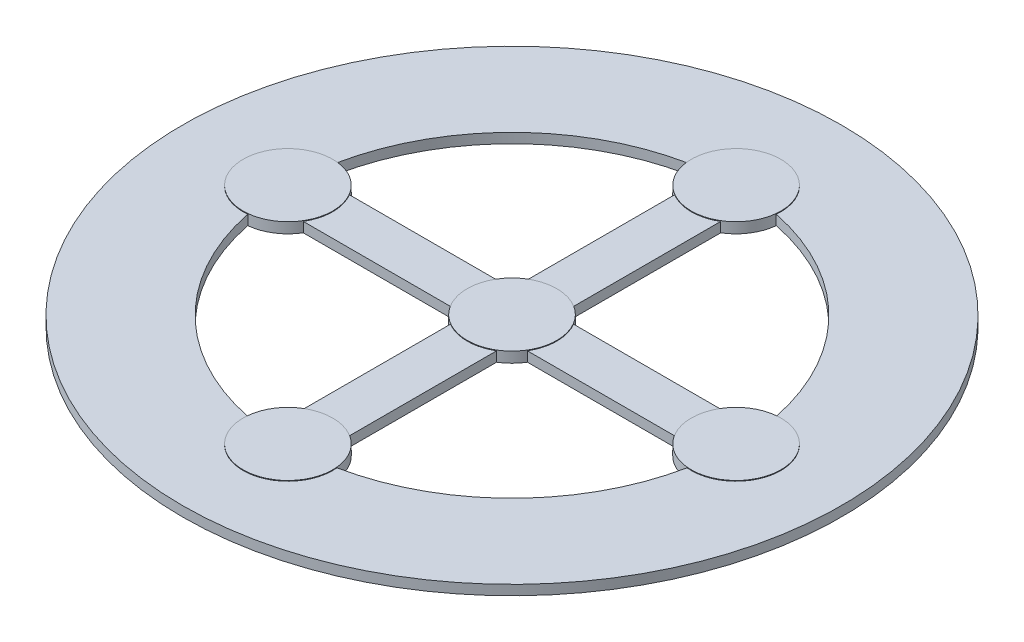
ISO-10303-21;
HEADER;
FILE_DESCRIPTION(('STEP AP214'),'2;1');
FILE_NAME('part.step','',(''),(''),'','','');
FILE_SCHEMA(('AUTOMOTIVE_DESIGN { 1 0 10303 214 1 1 1 1 }'));
ENDSEC;
DATA;
#1=APPLICATION_CONTEXT('core data for automotive mechanical design processes');
#2=APPLICATION_PROTOCOL_DEFINITION('international standard','automotive_design',2000,#1);
#3=PRODUCT_CONTEXT('',#1,'mechanical');
#4=PRODUCT('Part','Part','',(#3));
#5=PRODUCT_RELATED_PRODUCT_CATEGORY('part','',(#4));
#6=PRODUCT_DEFINITION_FORMATION('','',#4);
#7=PRODUCT_DEFINITION_CONTEXT('part definition',#1,'design');
#8=PRODUCT_DEFINITION('design','',#6,#7);
#9=PRODUCT_DEFINITION_SHAPE('','',#8);
#10=(LENGTH_UNIT() NAMED_UNIT(*) SI_UNIT(.MILLI.,.METRE.));
#11=(NAMED_UNIT(*) PLANE_ANGLE_UNIT() SI_UNIT($,.RADIAN.));
#12=(NAMED_UNIT(*) SI_UNIT($,.STERADIAN.) SOLID_ANGLE_UNIT());
#13=UNCERTAINTY_MEASURE_WITH_UNIT(LENGTH_MEASURE(1.E-05),#10,'distance_accuracy_value','');
#14=(GEOMETRIC_REPRESENTATION_CONTEXT(3) GLOBAL_UNCERTAINTY_ASSIGNED_CONTEXT((#13)) GLOBAL_UNIT_ASSIGNED_CONTEXT((#10,
#11,#12)) REPRESENTATION_CONTEXT('',''));
#15=CARTESIAN_POINT('',(0.,0.,0.));
#16=DIRECTION('',(0.,0.,1.));
#17=DIRECTION('',(1.,0.,0.));
#18=AXIS2_PLACEMENT_3D('',#15,#16,#17);
#19=CARTESIAN_POINT('',(0.,15.,0.));
#20=DIRECTION('',(0.,1.,0.));
#21=DIRECTION('',(0.,0.,1.));
#22=AXIS2_PLACEMENT_3D('',#19,#20,#21);
#23=PLANE('',#22);
#24=DIRECTION('',(-1.,0.,0.));
#25=VECTOR('',#24,1.);
#26=CARTESIAN_POINT('',(-58.3009433885882,15.,34.9999999999994));
#27=LINE('',#26,#25);
#28=CARTESIAN_POINT('',(-58.3009433885882,15.,34.9999999999994));
#29=VERTEX_POINT('',#28);
#30=CARTESIAN_POINT('',(-281.69905661141,15.,34.9999999999983));
#31=VERTEX_POINT('',#30);
#32=EDGE_CURVE('E268',#29,#31,#27,.T.);
#33=ORIENTED_EDGE('',*,*,#32,.F.);
#34=CARTESIAN_POINT('',(0.,15.,0.));
#35=DIRECTION('',(0.,1.,0.));
#36=DIRECTION('',(0.,0.,1.));
#37=AXIS2_PLACEMENT_3D('',#34,#35,#36);
#38=CIRCLE('',#37,67.9999999999951);
#39=CARTESIAN_POINT('',(-58.3009433885875,15.,-35.0000000000006));
#40=VERTEX_POINT('',#39);
#41=EDGE_CURVE('E224',#40,#29,#38,.T.);
#42=ORIENTED_EDGE('',*,*,#41,.F.);
#43=DIRECTION('',(1.,0.,0.));
#44=VECTOR('',#43,1.);
#45=CARTESIAN_POINT('',(-281.699056611412,15.,-35.000000000003));
#46=LINE('',#45,#44);
#47=CARTESIAN_POINT('',(-281.699056611415,15.,-35.0000000000029));
#48=VERTEX_POINT('',#47);
#49=EDGE_CURVE('E438',#48,#40,#46,.T.);
#50=ORIENTED_EDGE('',*,*,#49,.F.);
#51=CARTESIAN_POINT('',(-340.,15.,1.18710365520667E-12));
#52=DIRECTION('',(0.,1.,0.));
#53=DIRECTION('',(0.,0.,1.));
#54=AXIS2_PLACEMENT_3D('',#51,#52,#53);
#55=CIRCLE('',#54,67.9999999999951);
#56=EDGE_CURVE('E12',#48,#31,#55,.F.);
#57=ORIENTED_EDGE('',*,*,#56,.T.);
#58=EDGE_LOOP('',(#33,#42,#50,#57));
#59=FACE_BOUND('',#58,.T.);
#60=ADVANCED_FACE('F48',(#59),#23,.T.);
#61=DIRECTION('',(0.,0.,-1.));
#62=VECTOR('',#61,1.);
#63=CARTESIAN_POINT('',(-35.,15.,-58.3009433885879));
#64=LINE('',#63,#62);
#65=CARTESIAN_POINT('',(-35.,15.,-58.3009433885879));
#66=VERTEX_POINT('',#65);
#67=CARTESIAN_POINT('',(-35.,15.,-281.699056611412));
#68=VERTEX_POINT('',#67);
#69=EDGE_CURVE('E265',#66,#68,#64,.T.);
#70=ORIENTED_EDGE('',*,*,#69,.F.);
#71=CARTESIAN_POINT('',(35.,15.,-58.3009433885879));
#72=VERTEX_POINT('',#71);
#73=EDGE_CURVE('E64',#72,#66,#38,.T.);
#74=ORIENTED_EDGE('',*,*,#73,.F.);
#75=DIRECTION('',(0.,0.,1.));
#76=VECTOR('',#75,1.);
#77=CARTESIAN_POINT('',(35.,15.,-281.699056611412));
#78=LINE('',#77,#76);
#79=CARTESIAN_POINT('',(35.,15.,-281.699056611412));
#80=VERTEX_POINT('',#79);
#81=EDGE_CURVE('E423',#80,#72,#78,.T.);
#82=ORIENTED_EDGE('',*,*,#81,.F.);
#83=CARTESIAN_POINT('',(0.,15.,-340.));
#84=DIRECTION('',(0.,1.,0.));
#85=DIRECTION('',(0.,0.,1.));
#86=AXIS2_PLACEMENT_3D('',#83,#84,#85);
#87=CIRCLE('',#86,67.9999999999951);
#88=EDGE_CURVE('E391',#68,#80,#87,.T.);
#89=ORIENTED_EDGE('',*,*,#88,.F.);
#90=EDGE_LOOP('',(#70,#74,#82,#89));
#91=FACE_BOUND('',#90,.T.);
#92=ADVANCED_FACE('F559',(#91),#23,.T.);
#93=DIRECTION('',(1.,0.,0.));
#94=VECTOR('',#93,1.);
#95=CARTESIAN_POINT('',(58.300943388588,15.,-34.9999999999998));
#96=LINE('',#95,#94);
#97=CARTESIAN_POINT('',(58.300943388588,15.,-34.9999999999998));
#98=VERTEX_POINT('',#97);
#99=CARTESIAN_POINT('',(281.69905661141,15.,-35.0000000000003));
#100=VERTEX_POINT('',#99);
#101=EDGE_CURVE('E406',#98,#100,#96,.T.);
#102=ORIENTED_EDGE('',*,*,#101,.F.);
#103=CARTESIAN_POINT('',(58.3009433885877,15.,35.0000000000002));
#104=VERTEX_POINT('',#103);
#105=EDGE_CURVE('E226',#104,#98,#38,.T.);
#106=ORIENTED_EDGE('',*,*,#105,.F.);
#107=DIRECTION('',(-1.,0.,0.));
#108=VECTOR('',#107,1.);
#109=CARTESIAN_POINT('',(281.699056611412,15.,35.000000000001));
#110=LINE('',#109,#108);
#111=CARTESIAN_POINT('',(281.699056611415,15.,35.000000000001));
#112=VERTEX_POINT('',#111);
#113=EDGE_CURVE('E242',#112,#104,#110,.T.);
#114=ORIENTED_EDGE('',*,*,#113,.F.);
#115=CARTESIAN_POINT('',(340.,15.,-3.56131096562E-12));
#116=DIRECTION('',(0.,1.,0.));
#117=DIRECTION('',(0.,0.,1.));
#118=AXIS2_PLACEMENT_3D('',#115,#116,#117);
#119=CIRCLE('',#118,67.9999999999951);
#120=EDGE_CURVE('E393',#112,#100,#119,.F.);
#121=ORIENTED_EDGE('',*,*,#120,.T.);
#122=EDGE_LOOP('',(#102,#106,#114,#121));
#123=FACE_BOUND('',#122,.T.);
#124=ADVANCED_FACE('F404',(#123),#23,.T.);
#125=DIRECTION('',(0.,0.,1.));
#126=VECTOR('',#125,1.);
#127=CARTESIAN_POINT('',(34.9999999999996,15.,58.3009433885881));
#128=LINE('',#127,#126);
#129=CARTESIAN_POINT('',(34.9999999999996,15.,58.3009433885881));
#130=VERTEX_POINT('',#129);
#131=CARTESIAN_POINT('',(34.9999999999997,15.,281.699056611412));
#132=VERTEX_POINT('',#131);
#133=EDGE_CURVE('E231',#130,#132,#128,.T.);
#134=ORIENTED_EDGE('',*,*,#133,.F.);
#135=CARTESIAN_POINT('',(-35.0000000000004,15.,58.3009433885876));
#136=VERTEX_POINT('',#135);
#137=EDGE_CURVE('E210',#136,#130,#38,.T.);
#138=ORIENTED_EDGE('',*,*,#137,.F.);
#139=DIRECTION('',(0.,0.,-1.));
#140=VECTOR('',#139,1.);
#141=CARTESIAN_POINT('',(-35.0000000000012,15.,281.699056611413));
#142=LINE('',#141,#140);
#143=CARTESIAN_POINT('',(-35.0000000000012,15.,281.699056611413));
#144=VERTEX_POINT('',#143);
#145=EDGE_CURVE('E264',#144,#136,#142,.T.);
#146=ORIENTED_EDGE('',*,*,#145,.F.);
#147=CARTESIAN_POINT('',(0.,15.,340.));
#148=DIRECTION('',(0.,1.,0.));
#149=DIRECTION('',(0.,0.,1.));
#150=AXIS2_PLACEMENT_3D('',#147,#148,#149);
#151=CIRCLE('',#150,67.9999999999951);
#152=EDGE_CURVE('E239',#144,#132,#151,.F.);
#153=ORIENTED_EDGE('',*,*,#152,.T.);
#154=EDGE_LOOP('',(#134,#138,#146,#153));
#155=FACE_BOUND('',#154,.T.);
#156=ADVANCED_FACE('F238',(#155),#23,.T.);
#157=CARTESIAN_POINT('',(0.,0.,0.));
#158=DIRECTION('',(0.,1.,0.));
#159=DIRECTION('',(0.,0.,1.));
#160=AXIS2_PLACEMENT_3D('',#157,#158,#159);
#161=PLANE('',#160);
#162=CARTESIAN_POINT('',(0.,0.,0.));
#163=DIRECTION('',(0.,1.,0.));
#164=DIRECTION('',(0.,0.,1.));
#165=AXIS2_PLACEMENT_3D('',#162,#163,#164);
#166=CIRCLE('',#165,500.);
#167=CARTESIAN_POINT('',(0.,0.,500.));
#168=VERTEX_POINT('',#167);
#169=EDGE_CURVE('E277',#168,#168,#166,.T.);
#170=ORIENTED_EDGE('',*,*,#169,.F.);
#171=EDGE_LOOP('',(#170));
#172=FACE_BOUND('',#171,.T.);
#173=CARTESIAN_POINT('',(-340.,0.,-3.56131096562E-12));
#174=DIRECTION('',(0.,1.,0.));
#175=DIRECTION('',(0.,0.,1.));
#176=AXIS2_PLACEMENT_3D('',#173,#174,#175);
#177=CIRCLE('',#176,67.9999999999951);
#178=CARTESIAN_POINT('',(-281.699056611412,0.,34.9999999999971));
#179=VERTEX_POINT('',#178);
#180=CARTESIAN_POINT('',(-333.200000000002,0.,67.6591457232418));
#181=VERTEX_POINT('',#180);
#182=EDGE_CURVE('E311',#179,#181,#177,.F.);
#183=ORIENTED_EDGE('',*,*,#182,.T.);
#184=CARTESIAN_POINT('',(0.,0.,0.));
#185=DIRECTION('',(0.,1.,0.));
#186=DIRECTION('',(0.,0.,1.));
#187=AXIS2_PLACEMENT_3D('',#184,#185,#186);
#188=CIRCLE('',#187,340.);
#189=CARTESIAN_POINT('',(-67.6591457232464,0.,333.200000000001));
#190=VERTEX_POINT('',#189);
#191=EDGE_CURVE('E315',#181,#190,#188,.T.);
#192=ORIENTED_EDGE('',*,*,#191,.T.);
#193=CARTESIAN_POINT('',(-1.16628465962116E-12,0.,340.000000000001));
#194=DIRECTION('',(0.,1.,0.));
#195=DIRECTION('',(0.,0.,1.));
#196=AXIS2_PLACEMENT_3D('',#193,#194,#195);
#197=CIRCLE('',#196,67.9999999999952);
#198=CARTESIAN_POINT('',(-35.0000000000012,0.,281.699056611413));
#199=VERTEX_POINT('',#198);
#200=EDGE_CURVE('E295',#190,#199,#197,.F.);
#201=ORIENTED_EDGE('',*,*,#200,.T.);
#202=DIRECTION('',(0.,0.,-1.));
#203=VECTOR('',#202,1.);
#204=CARTESIAN_POINT('',(-35.0000000000002,0.,-1.17409312811016E-13));
#205=LINE('',#204,#203);
#206=CARTESIAN_POINT('',(-35.0000000000004,0.,58.3009433885876));
#207=VERTEX_POINT('',#206);
#208=EDGE_CURVE('E299',#199,#207,#205,.T.);
#209=ORIENTED_EDGE('',*,*,#208,.T.);
#210=CARTESIAN_POINT('',(0.,0.,0.));
#211=DIRECTION('',(0.,1.,0.));
#212=DIRECTION('',(0.,0.,1.));
#213=AXIS2_PLACEMENT_3D('',#210,#211,#212);
#214=CIRCLE('',#213,67.9999999999951);
#215=CARTESIAN_POINT('',(-58.3009433885882,0.,34.9999999999994));
#216=VERTEX_POINT('',#215);
#217=EDGE_CURVE('E303',#207,#216,#214,.F.);
#218=ORIENTED_EDGE('',*,*,#217,.T.);
#219=DIRECTION('',(-1.,0.,0.));
#220=VECTOR('',#219,1.);
#221=CARTESIAN_POINT('',(-3.70709033968115E-13,0.,35.));
#222=LINE('',#221,#220);
#223=EDGE_CURVE('E307',#216,#179,#222,.T.);
#224=ORIENTED_EDGE('',*,*,#223,.T.);
#225=EDGE_LOOP('',(#183,#192,#201,#209,#218,#224));
#226=FACE_BOUND('',#225,.T.);
#227=CARTESIAN_POINT('',(0.,0.,0.));
#228=DIRECTION('',(0.,1.,0.));
#229=DIRECTION('',(0.,0.,1.));
#230=AXIS2_PLACEMENT_3D('',#227,#228,#229);
#231=CIRCLE('',#230,340.);
#232=CARTESIAN_POINT('',(333.200000000001,0.,-67.6591457232442));
#233=VERTEX_POINT('',#232);
#234=CARTESIAN_POINT('',(67.6591457232453,0.,-333.200000000001));
#235=VERTEX_POINT('',#234);
#236=EDGE_CURVE('E335',#233,#235,#231,.T.);
#237=ORIENTED_EDGE('',*,*,#236,.T.);
#238=CARTESIAN_POINT('',(0.,0.,-340.));
#239=DIRECTION('',(0.,1.,0.));
#240=DIRECTION('',(0.,0.,1.));
#241=AXIS2_PLACEMENT_3D('',#238,#239,#240);
#242=CIRCLE('',#241,67.9999999999951);
#243=CARTESIAN_POINT('',(35.,0.,-281.699056611412));
#244=VERTEX_POINT('',#243);
#245=EDGE_CURVE('E339',#235,#244,#242,.F.);
#246=ORIENTED_EDGE('',*,*,#245,.T.);
#247=DIRECTION('',(0.,0.,1.));
#248=VECTOR('',#247,1.);
#249=CARTESIAN_POINT('',(35.,0.,0.));
#250=LINE('',#249,#248);
#251=CARTESIAN_POINT('',(35.,0.,-58.3009433885879));
#252=VERTEX_POINT('',#251);
#253=EDGE_CURVE('E319',#244,#252,#250,.T.);
#254=ORIENTED_EDGE('',*,*,#253,.T.);
#255=CARTESIAN_POINT('',(0.,0.,0.));
#256=DIRECTION('',(0.,1.,0.));
#257=DIRECTION('',(0.,0.,1.));
#258=AXIS2_PLACEMENT_3D('',#255,#256,#257);
#259=CIRCLE('',#258,67.9999999999951);
#260=CARTESIAN_POINT('',(58.300943388588,0.,-34.9999999999998));
#261=VERTEX_POINT('',#260);
#262=EDGE_CURVE('E323',#252,#261,#259,.F.);
#263=ORIENTED_EDGE('',*,*,#262,.T.);
#264=DIRECTION('',(1.,0.,0.));
#265=VECTOR('',#264,1.);
#266=CARTESIAN_POINT('',(1.27193422211934E-13,0.,-35.));
#267=LINE('',#266,#265);
#268=CARTESIAN_POINT('',(281.699056611412,0.,-34.999999999999));
#269=VERTEX_POINT('',#268);
#270=EDGE_CURVE('E327',#261,#269,#267,.T.);
#271=ORIENTED_EDGE('',*,*,#270,.T.);
#272=CARTESIAN_POINT('',(340.,0.,1.18710365520667E-12));
#273=DIRECTION('',(0.,1.,0.));
#274=DIRECTION('',(0.,0.,1.));
#275=AXIS2_PLACEMENT_3D('',#272,#273,#274);
#276=CIRCLE('',#275,67.9999999999951);
#277=EDGE_CURVE('E331',#269,#233,#276,.F.);
#278=ORIENTED_EDGE('',*,*,#277,.T.);
#279=EDGE_LOOP('',(#237,#246,#254,#263,#271,#278));
#280=FACE_BOUND('',#279,.T.);
#281=CARTESIAN_POINT('',(-1.16628465962116E-12,0.,340.000000000001));
#282=DIRECTION('',(0.,1.,0.));
#283=DIRECTION('',(0.,0.,1.));
#284=AXIS2_PLACEMENT_3D('',#281,#282,#283);
#285=CIRCLE('',#284,67.9999999999952);
#286=CARTESIAN_POINT('',(34.9999999999988,0.,281.699056611413));
#287=VERTEX_POINT('',#286);
#288=CARTESIAN_POINT('',(67.6591457232441,0.,333.200000000001));
#289=VERTEX_POINT('',#288);
#290=EDGE_CURVE('E359',#287,#289,#285,.F.);
#291=ORIENTED_EDGE('',*,*,#290,.T.);
#292=CARTESIAN_POINT('',(0.,0.,0.));
#293=DIRECTION('',(0.,1.,0.));
#294=DIRECTION('',(0.,0.,1.));
#295=AXIS2_PLACEMENT_3D('',#292,#293,#294);
#296=CIRCLE('',#295,340.);
#297=CARTESIAN_POINT('',(333.200000000001,0.,67.6591457232465));
#298=VERTEX_POINT('',#297);
#299=EDGE_CURVE('E363',#289,#298,#296,.T.);
#300=ORIENTED_EDGE('',*,*,#299,.T.);
#301=CARTESIAN_POINT('',(340.,0.,1.18710365520667E-12));
#302=DIRECTION('',(0.,1.,0.));
#303=DIRECTION('',(0.,0.,1.));
#304=AXIS2_PLACEMENT_3D('',#301,#302,#303);
#305=CIRCLE('',#304,67.9999999999951);
#306=CARTESIAN_POINT('',(281.699056611412,0.,35.000000000001));
#307=VERTEX_POINT('',#306);
#308=EDGE_CURVE('E343',#298,#307,#305,.F.);
#309=ORIENTED_EDGE('',*,*,#308,.T.);
#310=DIRECTION('',(-1.,0.,0.));
#311=VECTOR('',#310,1.);
#312=CARTESIAN_POINT('',(-1.18496436077785E-13,0.,35.));
#313=LINE('',#312,#311);
#314=CARTESIAN_POINT('',(58.3009433885877,0.,35.0000000000002));
#315=VERTEX_POINT('',#314);
#316=EDGE_CURVE('E350',#307,#315,#313,.T.);
#317=ORIENTED_EDGE('',*,*,#316,.T.);
#318=CARTESIAN_POINT('',(0.,0.,0.));
#319=DIRECTION('',(0.,1.,0.));
#320=DIRECTION('',(0.,0.,1.));
#321=AXIS2_PLACEMENT_3D('',#318,#319,#320);
#322=CIRCLE('',#321,67.9999999999951);
#323=CARTESIAN_POINT('',(34.9999999999996,0.,58.3009433885881));
#324=VERTEX_POINT('',#323);
#325=EDGE_CURVE('E354',#315,#324,#322,.F.);
#326=ORIENTED_EDGE('',*,*,#325,.T.);
#327=DIRECTION('',(0.,0.,1.));
#328=VECTOR('',#327,1.);
#329=CARTESIAN_POINT('',(34.9999999999998,0.,1.26106298945164E-13));
#330=LINE('',#329,#328);
#331=EDGE_CURVE('E233',#324,#287,#330,.T.);
#332=ORIENTED_EDGE('',*,*,#331,.T.);
#333=EDGE_LOOP('',(#291,#300,#309,#317,#326,#332));
#334=FACE_BOUND('',#333,.T.);
#335=DIRECTION('',(1.,0.,0.));
#336=VECTOR('',#335,1.);
#337=CARTESIAN_POINT('',(3.62012047833966E-13,0.,-35.));
#338=LINE('',#337,#336);
#339=CARTESIAN_POINT('',(-281.699056611412,0.,-35.000000000003));
#340=VERTEX_POINT('',#339);
#341=CARTESIAN_POINT('',(-58.3009433885875,0.,-35.0000000000006));
#342=VERTEX_POINT('',#341);
#343=EDGE_CURVE('E383',#340,#342,#338,.T.);
#344=ORIENTED_EDGE('',*,*,#343,.T.);
#345=CARTESIAN_POINT('',(0.,0.,0.));
#346=DIRECTION('',(0.,1.,0.));
#347=DIRECTION('',(0.,0.,1.));
#348=AXIS2_PLACEMENT_3D('',#345,#346,#347);
#349=CIRCLE('',#348,67.9999999999951);
#350=CARTESIAN_POINT('',(-35.,0.,-58.3009433885879));
#351=VERTEX_POINT('',#350);
#352=EDGE_CURVE('E387',#342,#351,#349,.F.);
#353=ORIENTED_EDGE('',*,*,#352,.T.);
#354=DIRECTION('',(0.,0.,-1.));
#355=VECTOR('',#354,1.);
#356=CARTESIAN_POINT('',(-35.,0.,0.));
#357=LINE('',#356,#355);
#358=CARTESIAN_POINT('',(-35.,0.,-281.699056611412));
#359=VERTEX_POINT('',#358);
#360=EDGE_CURVE('E367',#351,#359,#357,.T.);
#361=ORIENTED_EDGE('',*,*,#360,.T.);
#362=CARTESIAN_POINT('',(0.,0.,-340.));
#363=DIRECTION('',(0.,1.,0.));
#364=DIRECTION('',(0.,0.,1.));
#365=AXIS2_PLACEMENT_3D('',#362,#363,#364);
#366=CIRCLE('',#365,67.9999999999951);
#367=CARTESIAN_POINT('',(-67.6591457232453,0.,-333.200000000001));
#368=VERTEX_POINT('',#367);
#369=EDGE_CURVE('E371',#359,#368,#366,.F.);
#370=ORIENTED_EDGE('',*,*,#369,.T.);
#371=CARTESIAN_POINT('',(0.,0.,0.));
#372=DIRECTION('',(0.,1.,0.));
#373=DIRECTION('',(0.,0.,1.));
#374=AXIS2_PLACEMENT_3D('',#371,#372,#373);
#375=CIRCLE('',#374,340.);
#376=CARTESIAN_POINT('',(-333.2,0.,-67.659145723249));
#377=VERTEX_POINT('',#376);
#378=EDGE_CURVE('E375',#368,#377,#375,.T.);
#379=ORIENTED_EDGE('',*,*,#378,.T.);
#380=CARTESIAN_POINT('',(-340.,0.,-3.56131096562E-12));
#381=DIRECTION('',(0.,1.,0.));
#382=DIRECTION('',(0.,0.,1.));
#383=AXIS2_PLACEMENT_3D('',#380,#381,#382);
#384=CIRCLE('',#383,67.9999999999951);
#385=EDGE_CURVE('E379',#377,#340,#384,.F.);
#386=ORIENTED_EDGE('',*,*,#385,.T.);
#387=EDGE_LOOP('',(#344,#353,#361,#370,#379,#386));
#388=FACE_BOUND('',#387,.T.);
#389=ADVANCED_FACE('F50',(#172,#226,#280,#334,#388),#161,.F.);
#390=CARTESIAN_POINT('',(0.,-15.,0.));
#391=DIRECTION('',(0.,1.,0.));
#392=DIRECTION('',(0.,0.,1.));
#393=AXIS2_PLACEMENT_3D('',#390,#391,#392);
#394=CYLINDRICAL_SURFACE('',#393,340.);
#395=DIRECTION('',(0.,1.,0.));
#396=VECTOR('',#395,1.);
#397=CARTESIAN_POINT('',(-333.200000000002,-15.,67.6591457232418));
#398=LINE('',#397,#396);
#399=CARTESIAN_POINT('',(-333.200000000001,15.,67.6591457232465));
#400=VERTEX_POINT('',#399);
#401=EDGE_CURVE('E273',#181,#400,#398,.T.);
#402=ORIENTED_EDGE('',*,*,#401,.T.);
#403=CARTESIAN_POINT('',(0.,15.,0.));
#404=DIRECTION('',(0.,1.,0.));
#405=DIRECTION('',(0.,0.,1.));
#406=AXIS2_PLACEMENT_3D('',#403,#404,#405);
#407=CIRCLE('',#406,340.);
#408=CARTESIAN_POINT('',(-67.6591457232464,15.,333.200000000001));
#409=VERTEX_POINT('',#408);
#410=EDGE_CURVE('E260',#400,#409,#407,.T.);
#411=ORIENTED_EDGE('',*,*,#410,.T.);
#412=DIRECTION('',(0.,1.,0.));
#413=VECTOR('',#412,1.);
#414=CARTESIAN_POINT('',(-67.6591457232464,-15.,333.200000000001));
#415=LINE('',#414,#413);
#416=EDGE_CURVE('E272',#190,#409,#415,.T.);
#417=ORIENTED_EDGE('',*,*,#416,.F.);
#418=ORIENTED_EDGE('',*,*,#191,.F.);
#419=EDGE_LOOP('',(#402,#411,#417,#418));
#420=FACE_BOUND('',#419,.T.);
#421=ADVANCED_FACE('F568',(#420),#394,.F.);
#422=CARTESIAN_POINT('',(-58.3009433885882,-15.,34.9999999999994));
#423=DIRECTION('',(0.,0.,-1.));
#424=DIRECTION('',(-1.,0.,0.));
#425=AXIS2_PLACEMENT_3D('',#422,#423,#424);
#426=PLANE('',#425);
#427=DIRECTION('',(0.,1.,0.));
#428=VECTOR('',#427,1.);
#429=CARTESIAN_POINT('',(-58.3009433885882,-15.,34.9999999999994));
#430=LINE('',#429,#428);
#431=EDGE_CURVE('E282',#216,#29,#430,.T.);
#432=ORIENTED_EDGE('',*,*,#431,.T.);
#433=ORIENTED_EDGE('',*,*,#32,.T.);
#434=DIRECTION('',(0.,1.,0.));
#435=VECTOR('',#434,1.);
#436=CARTESIAN_POINT('',(-281.699056611412,-15.,34.9999999999971));
#437=LINE('',#436,#435);
#438=EDGE_CURVE('E278',#179,#31,#437,.T.);
#439=ORIENTED_EDGE('',*,*,#438,.F.);
#440=ORIENTED_EDGE('',*,*,#223,.F.);
#441=EDGE_LOOP('',(#432,#433,#439,#440));
#442=FACE_BOUND('',#441,.T.);
#443=ADVANCED_FACE('F571',(#442),#426,.F.);
#444=CARTESIAN_POINT('',(-35.0000000000012,-15.,281.699056611413));
#445=DIRECTION('',(1.,0.,0.));
#446=DIRECTION('',(0.,0.,-1.));
#447=AXIS2_PLACEMENT_3D('',#444,#445,#446);
#448=PLANE('',#447);
#449=DIRECTION('',(0.,1.,0.));
#450=VECTOR('',#449,1.);
#451=CARTESIAN_POINT('',(-35.0000000000012,-15.,281.699056611413));
#452=LINE('',#451,#450);
#453=EDGE_CURVE('E288',#199,#144,#452,.T.);
#454=ORIENTED_EDGE('',*,*,#453,.T.);
#455=ORIENTED_EDGE('',*,*,#145,.T.);
#456=DIRECTION('',(0.,1.,0.));
#457=VECTOR('',#456,1.);
#458=CARTESIAN_POINT('',(-35.0000000000004,-15.,58.3009433885876));
#459=LINE('',#458,#457);
#460=EDGE_CURVE('E218',#207,#136,#459,.T.);
#461=ORIENTED_EDGE('',*,*,#460,.F.);
#462=ORIENTED_EDGE('',*,*,#208,.F.);
#463=EDGE_LOOP('',(#454,#455,#461,#462));
#464=FACE_BOUND('',#463,.T.);
#465=ADVANCED_FACE('F573',(#464),#448,.F.);
#466=CARTESIAN_POINT('',(0.,-15.,0.));
#467=DIRECTION('',(0.,1.,0.));
#468=DIRECTION('',(0.,0.,1.));
#469=AXIS2_PLACEMENT_3D('',#466,#467,#468);
#470=CYLINDRICAL_SURFACE('',#469,340.);
#471=DIRECTION('',(0.,1.,0.));
#472=VECTOR('',#471,1.);
#473=CARTESIAN_POINT('',(333.200000000001,-15.,-67.6591457232442));
#474=LINE('',#473,#472);
#475=CARTESIAN_POINT('',(333.2,15.,-67.6591457232488));
#476=VERTEX_POINT('',#475);
#477=EDGE_CURVE('E417',#233,#476,#474,.T.);
#478=ORIENTED_EDGE('',*,*,#477,.T.);
#479=CARTESIAN_POINT('',(0.,15.,0.));
#480=DIRECTION('',(0.,1.,0.));
#481=DIRECTION('',(0.,0.,1.));
#482=AXIS2_PLACEMENT_3D('',#479,#480,#481);
#483=CIRCLE('',#482,340.);
#484=CARTESIAN_POINT('',(67.6591457232453,15.,-333.200000000001));
#485=VERTEX_POINT('',#484);
#486=EDGE_CURVE('E424',#476,#485,#483,.T.);
#487=ORIENTED_EDGE('',*,*,#486,.T.);
#488=DIRECTION('',(0.,1.,0.));
#489=VECTOR('',#488,1.);
#490=CARTESIAN_POINT('',(67.6591457232453,-15.,-333.200000000001));
#491=LINE('',#490,#489);
#492=EDGE_CURVE('E488',#235,#485,#491,.T.);
#493=ORIENTED_EDGE('',*,*,#492,.F.);
#494=ORIENTED_EDGE('',*,*,#236,.F.);
#495=EDGE_LOOP('',(#478,#487,#493,#494));
#496=FACE_BOUND('',#495,.T.);
#497=ADVANCED_FACE('F510',(#496),#470,.F.);
#498=CARTESIAN_POINT('',(58.300943388588,-15.,-34.9999999999998));
#499=DIRECTION('',(0.,0.,1.));
#500=DIRECTION('',(1.,0.,0.));
#501=AXIS2_PLACEMENT_3D('',#498,#499,#500);
#502=PLANE('',#501);
#503=DIRECTION('',(0.,1.,0.));
#504=VECTOR('',#503,1.);
#505=CARTESIAN_POINT('',(58.300943388588,-15.,-34.9999999999998));
#506=LINE('',#505,#504);
#507=EDGE_CURVE('E416',#261,#98,#506,.T.);
#508=ORIENTED_EDGE('',*,*,#507,.T.);
#509=ORIENTED_EDGE('',*,*,#101,.T.);
#510=DIRECTION('',(0.,1.,0.));
#511=VECTOR('',#510,1.);
#512=CARTESIAN_POINT('',(281.699056611412,-15.,-34.999999999999));
#513=LINE('',#512,#511);
#514=EDGE_CURVE('E410',#269,#100,#513,.T.);
#515=ORIENTED_EDGE('',*,*,#514,.F.);
#516=ORIENTED_EDGE('',*,*,#270,.F.);
#517=EDGE_LOOP('',(#508,#509,#515,#516));
#518=FACE_BOUND('',#517,.T.);
#519=ADVANCED_FACE('F420',(#518),#502,.F.);
#520=CARTESIAN_POINT('',(35.,-15.,-281.699056611412));
#521=DIRECTION('',(-1.,0.,0.));
#522=DIRECTION('',(0.,0.,1.));
#523=AXIS2_PLACEMENT_3D('',#520,#521,#522);
#524=PLANE('',#523);
#525=DIRECTION('',(0.,1.,0.));
#526=VECTOR('',#525,1.);
#527=CARTESIAN_POINT('',(35.,-15.,-281.699056611412));
#528=LINE('',#527,#526);
#529=EDGE_CURVE('E431',#244,#80,#528,.T.);
#530=ORIENTED_EDGE('',*,*,#529,.T.);
#531=ORIENTED_EDGE('',*,*,#81,.T.);
#532=DIRECTION('',(0.,1.,0.));
#533=VECTOR('',#532,1.);
#534=CARTESIAN_POINT('',(35.,-15.,-58.3009433885879));
#535=LINE('',#534,#533);
#536=EDGE_CURVE('E502',#252,#72,#535,.T.);
#537=ORIENTED_EDGE('',*,*,#536,.F.);
#538=ORIENTED_EDGE('',*,*,#253,.F.);
#539=EDGE_LOOP('',(#530,#531,#537,#538));
#540=FACE_BOUND('',#539,.T.);
#541=ADVANCED_FACE('F591',(#540),#524,.F.);
#542=CARTESIAN_POINT('',(0.,-15.,0.));
#543=DIRECTION('',(0.,1.,0.));
#544=DIRECTION('',(0.,0.,1.));
#545=AXIS2_PLACEMENT_3D('',#542,#543,#544);
#546=CYLINDRICAL_SURFACE('',#545,500.);
#547=CARTESIAN_POINT('',(0.,15.,0.));
#548=DIRECTION('',(0.,1.,0.));
#549=DIRECTION('',(0.,0.,1.));
#550=AXIS2_PLACEMENT_3D('',#547,#548,#549);
#551=CIRCLE('',#550,500.);
#552=CARTESIAN_POINT('',(0.,15.,500.));
#553=VERTEX_POINT('',#552);
#554=EDGE_CURVE('E485',#553,#553,#551,.T.);
#555=ORIENTED_EDGE('',*,*,#554,.F.);
#556=EDGE_LOOP('',(#555));
#557=FACE_BOUND('',#556,.T.);
#558=ORIENTED_EDGE('',*,*,#169,.T.);
#559=EDGE_LOOP('',(#558));
#560=FACE_BOUND('',#559,.T.);
#561=ADVANCED_FACE('F739',(#557,#560),#546,.T.);
#562=CARTESIAN_POINT('',(0.,-15.,0.));
#563=DIRECTION('',(0.,1.,0.));
#564=DIRECTION('',(0.,0.,1.));
#565=AXIS2_PLACEMENT_3D('',#562,#563,#564);
#566=CYLINDRICAL_SURFACE('',#565,340.);
#567=DIRECTION('',(0.,1.,0.));
#568=VECTOR('',#567,1.);
#569=CARTESIAN_POINT('',(67.6591457232441,-15.,333.200000000001));
#570=LINE('',#569,#568);
#571=CARTESIAN_POINT('',(67.6591457232453,15.,333.200000000001));
#572=VERTEX_POINT('',#571);
#573=EDGE_CURVE('E254',#289,#572,#570,.T.);
#574=ORIENTED_EDGE('',*,*,#573,.T.);
#575=CARTESIAN_POINT('',(0.,15.,0.));
#576=DIRECTION('',(0.,1.,0.));
#577=DIRECTION('',(0.,0.,1.));
#578=AXIS2_PLACEMENT_3D('',#575,#576,#577);
#579=CIRCLE('',#578,340.);
#580=CARTESIAN_POINT('',(333.200000000001,15.,67.6591457232465));
#581=VERTEX_POINT('',#580);
#582=EDGE_CURVE('E248',#572,#581,#579,.T.);
#583=ORIENTED_EDGE('',*,*,#582,.T.);
#584=DIRECTION('',(0.,1.,0.));
#585=VECTOR('',#584,1.);
#586=CARTESIAN_POINT('',(333.200000000001,-15.,67.6591457232465));
#587=LINE('',#586,#585);
#588=EDGE_CURVE('E243',#298,#581,#587,.T.);
#589=ORIENTED_EDGE('',*,*,#588,.F.);
#590=ORIENTED_EDGE('',*,*,#299,.F.);
#591=EDGE_LOOP('',(#574,#583,#589,#590));
#592=FACE_BOUND('',#591,.T.);
#593=ADVANCED_FACE('F476',(#592),#566,.F.);
#594=CARTESIAN_POINT('',(-1.16628465962116E-12,-15.,340.000000000001));
#595=DIRECTION('',(0.,1.,0.));
#596=DIRECTION('',(0.,0.,1.));
#597=AXIS2_PLACEMENT_3D('',#594,#595,#596);
#598=CYLINDRICAL_SURFACE('',#597,67.9999999999952);
#599=DIRECTION('',(0.,1.,0.));
#600=VECTOR('',#599,1.);
#601=CARTESIAN_POINT('',(34.9999999999988,-15.,281.699056611413));
#602=LINE('',#601,#600);
#603=EDGE_CURVE('E236',#287,#132,#602,.T.);
#604=ORIENTED_EDGE('',*,*,#603,.T.);
#605=ORIENTED_EDGE('',*,*,#152,.F.);
#606=ORIENTED_EDGE('',*,*,#453,.F.);
#607=ORIENTED_EDGE('',*,*,#200,.F.);
#608=ORIENTED_EDGE('',*,*,#416,.T.);
#609=EDGE_CURVE('E395',#572,#409,#151,.F.);
#610=ORIENTED_EDGE('',*,*,#609,.F.);
#611=ORIENTED_EDGE('',*,*,#573,.F.);
#612=ORIENTED_EDGE('',*,*,#290,.F.);
#613=EDGE_LOOP('',(#604,#605,#606,#607,#608,#610,#611,#612));
#614=FACE_BOUND('',#613,.T.);
#615=CARTESIAN_POINT('',(0.,16.,340.));
#616=DIRECTION('',(0.,1.,0.));
#617=DIRECTION('',(0.,0.,-1.));
#618=AXIS2_PLACEMENT_3D('',#615,#616,#617);
#619=CIRCLE('',#618,67.9999999999951);
#620=CARTESIAN_POINT('',(0.,16.,272.000000000005));
#621=VERTEX_POINT('',#620);
#622=EDGE_CURVE('E535',#621,#621,#619,.T.);
#623=ORIENTED_EDGE('',*,*,#622,.F.);
#624=EDGE_LOOP('',(#623));
#625=FACE_BOUND('',#624,.T.);
#626=ADVANCED_FACE('F580',(#614,#625),#598,.T.);
#627=CARTESIAN_POINT('',(34.9999999999996,-15.,58.3009433885881));
#628=DIRECTION('',(-1.,0.,0.));
#629=DIRECTION('',(0.,0.,1.));
#630=AXIS2_PLACEMENT_3D('',#627,#628,#629);
#631=PLANE('',#630);
#632=DIRECTION('',(0.,1.,0.));
#633=VECTOR('',#632,1.);
#634=CARTESIAN_POINT('',(34.9999999999996,-15.,58.3009433885881));
#635=LINE('',#634,#633);
#636=EDGE_CURVE('E215',#324,#130,#635,.T.);
#637=ORIENTED_EDGE('',*,*,#636,.T.);
#638=ORIENTED_EDGE('',*,*,#133,.T.);
#639=ORIENTED_EDGE('',*,*,#603,.F.);
#640=ORIENTED_EDGE('',*,*,#331,.F.);
#641=EDGE_LOOP('',(#637,#638,#639,#640));
#642=FACE_BOUND('',#641,.T.);
#643=ADVANCED_FACE('F229',(#642),#631,.F.);
#644=CARTESIAN_POINT('',(281.699056611412,-15.,35.000000000001));
#645=DIRECTION('',(0.,0.,-1.));
#646=DIRECTION('',(-1.,0.,0.));
#647=AXIS2_PLACEMENT_3D('',#644,#645,#646);
#648=PLANE('',#647);
#649=DIRECTION('',(0.,1.,0.));
#650=VECTOR('',#649,1.);
#651=CARTESIAN_POINT('',(281.699056611412,-15.,35.000000000001));
#652=LINE('',#651,#650);
#653=EDGE_CURVE('E251',#307,#112,#652,.T.);
#654=ORIENTED_EDGE('',*,*,#653,.T.);
#655=ORIENTED_EDGE('',*,*,#113,.T.);
#656=DIRECTION('',(0.,1.,0.));
#657=VECTOR('',#656,1.);
#658=CARTESIAN_POINT('',(58.3009433885877,-15.,35.0000000000002));
#659=LINE('',#658,#657);
#660=EDGE_CURVE('E235',#315,#104,#659,.T.);
#661=ORIENTED_EDGE('',*,*,#660,.F.);
#662=ORIENTED_EDGE('',*,*,#316,.F.);
#663=EDGE_LOOP('',(#654,#655,#661,#662));
#664=FACE_BOUND('',#663,.T.);
#665=ADVANCED_FACE('F545',(#664),#648,.F.);
#666=CARTESIAN_POINT('',(340.,-15.,1.18710365520667E-12));
#667=DIRECTION('',(0.,1.,0.));
#668=DIRECTION('',(0.,0.,1.));
#669=AXIS2_PLACEMENT_3D('',#666,#667,#668);
#670=CYLINDRICAL_SURFACE('',#669,67.9999999999951);
#671=ORIENTED_EDGE('',*,*,#588,.T.);
#672=EDGE_CURVE('E72',#476,#581,#119,.F.);
#673=ORIENTED_EDGE('',*,*,#672,.F.);
#674=ORIENTED_EDGE('',*,*,#477,.F.);
#675=ORIENTED_EDGE('',*,*,#277,.F.);
#676=ORIENTED_EDGE('',*,*,#514,.T.);
#677=ORIENTED_EDGE('',*,*,#120,.F.);
#678=ORIENTED_EDGE('',*,*,#653,.F.);
#679=ORIENTED_EDGE('',*,*,#308,.F.);
#680=EDGE_LOOP('',(#671,#673,#674,#675,#676,#677,#678,#679));
#681=FACE_BOUND('',#680,.T.);
#682=CARTESIAN_POINT('',(340.,16.,-3.56131096562E-12));
#683=DIRECTION('',(0.,1.,0.));
#684=DIRECTION('',(-1.,0.,0.));
#685=AXIS2_PLACEMENT_3D('',#682,#683,#684);
#686=CIRCLE('',#685,67.9999999999951);
#687=CARTESIAN_POINT('',(272.000000000005,16.,-2.84904877249605E-12));
#688=VERTEX_POINT('',#687);
#689=EDGE_CURVE('E529',#688,#688,#686,.T.);
#690=ORIENTED_EDGE('',*,*,#689,.F.);
#691=EDGE_LOOP('',(#690));
#692=FACE_BOUND('',#691,.T.);
#693=ADVANCED_FACE('F411',(#681,#692),#670,.T.);
#694=CARTESIAN_POINT('',(0.,-15.,0.));
#695=DIRECTION('',(0.,1.,0.));
#696=DIRECTION('',(0.,0.,1.));
#697=AXIS2_PLACEMENT_3D('',#694,#695,#696);
#698=CYLINDRICAL_SURFACE('',#697,67.9999999999951);
#699=DIRECTION('',(0.,1.,0.));
#700=VECTOR('',#699,1.);
#701=CARTESIAN_POINT('',(-58.3009433885875,-15.,-35.0000000000006));
#702=LINE('',#701,#700);
#703=EDGE_CURVE('E259',#342,#40,#702,.T.);
#704=ORIENTED_EDGE('',*,*,#703,.T.);
#705=ORIENTED_EDGE('',*,*,#41,.T.);
#706=ORIENTED_EDGE('',*,*,#431,.F.);
#707=ORIENTED_EDGE('',*,*,#217,.F.);
#708=ORIENTED_EDGE('',*,*,#460,.T.);
#709=ORIENTED_EDGE('',*,*,#137,.T.);
#710=ORIENTED_EDGE('',*,*,#636,.F.);
#711=ORIENTED_EDGE('',*,*,#325,.F.);
#712=ORIENTED_EDGE('',*,*,#660,.T.);
#713=ORIENTED_EDGE('',*,*,#105,.T.);
#714=ORIENTED_EDGE('',*,*,#507,.F.);
#715=ORIENTED_EDGE('',*,*,#262,.F.);
#716=ORIENTED_EDGE('',*,*,#536,.T.);
#717=ORIENTED_EDGE('',*,*,#73,.T.);
#718=DIRECTION('',(0.,1.,0.));
#719=VECTOR('',#718,1.);
#720=CARTESIAN_POINT('',(-35.,-15.,-58.3009433885879));
#721=LINE('',#720,#719);
#722=EDGE_CURVE('E435',#351,#66,#721,.T.);
#723=ORIENTED_EDGE('',*,*,#722,.F.);
#724=ORIENTED_EDGE('',*,*,#352,.F.);
#725=EDGE_LOOP('',(#704,#705,#706,#707,#708,#709,#710,#711,#712,#713,#714,#715,#716,#717,#723,#724));
#726=FACE_BOUND('',#725,.T.);
#727=CARTESIAN_POINT('',(0.,16.,0.));
#728=DIRECTION('',(0.,1.,0.));
#729=DIRECTION('',(0.,0.,1.));
#730=AXIS2_PLACEMENT_3D('',#727,#728,#729);
#731=CIRCLE('',#730,67.9999999999951);
#732=CARTESIAN_POINT('',(0.,16.,67.9999999999951));
#733=VERTEX_POINT('',#732);
#734=EDGE_CURVE('E525',#733,#733,#731,.T.);
#735=ORIENTED_EDGE('',*,*,#734,.F.);
#736=EDGE_LOOP('',(#735));
#737=FACE_BOUND('',#736,.T.);
#738=ADVANCED_FACE('F213',(#726,#737),#698,.T.);
#739=CARTESIAN_POINT('',(-281.699056611412,-15.,-35.000000000003));
#740=DIRECTION('',(0.,0.,1.));
#741=DIRECTION('',(1.,0.,0.));
#742=AXIS2_PLACEMENT_3D('',#739,#740,#741);
#743=PLANE('',#742);
#744=DIRECTION('',(0.,1.,0.));
#745=VECTOR('',#744,1.);
#746=CARTESIAN_POINT('',(-281.699056611412,-15.,-35.000000000003));
#747=LINE('',#746,#745);
#748=EDGE_CURVE('E450',#340,#48,#747,.T.);
#749=ORIENTED_EDGE('',*,*,#748,.T.);
#750=ORIENTED_EDGE('',*,*,#49,.T.);
#751=ORIENTED_EDGE('',*,*,#703,.F.);
#752=ORIENTED_EDGE('',*,*,#343,.F.);
#753=EDGE_LOOP('',(#749,#750,#751,#752));
#754=FACE_BOUND('',#753,.T.);
#755=ADVANCED_FACE('F552',(#754),#743,.F.);
#756=CARTESIAN_POINT('',(-340.,-15.,-3.56131096562E-12));
#757=DIRECTION('',(0.,1.,0.));
#758=DIRECTION('',(0.,0.,1.));
#759=AXIS2_PLACEMENT_3D('',#756,#757,#758);
#760=CYLINDRICAL_SURFACE('',#759,67.9999999999951);
#761=DIRECTION('',(0.,1.,0.));
#762=VECTOR('',#761,1.);
#763=CARTESIAN_POINT('',(-333.2,-15.,-67.659145723249));
#764=LINE('',#763,#762);
#765=CARTESIAN_POINT('',(-333.2,15.,-67.659145723249));
#766=VERTEX_POINT('',#765);
#767=EDGE_CURVE('E446',#377,#766,#764,.T.);
#768=ORIENTED_EDGE('',*,*,#767,.T.);
#769=EDGE_CURVE('E52',#400,#766,#55,.F.);
#770=ORIENTED_EDGE('',*,*,#769,.F.);
#771=ORIENTED_EDGE('',*,*,#401,.F.);
#772=ORIENTED_EDGE('',*,*,#182,.F.);
#773=ORIENTED_EDGE('',*,*,#438,.T.);
#774=ORIENTED_EDGE('',*,*,#56,.F.);
#775=ORIENTED_EDGE('',*,*,#748,.F.);
#776=ORIENTED_EDGE('',*,*,#385,.F.);
#777=EDGE_LOOP('',(#768,#770,#771,#772,#773,#774,#775,#776));
#778=FACE_BOUND('',#777,.T.);
#779=CARTESIAN_POINT('',(-340.,16.,1.18710365520667E-12));
#780=DIRECTION('',(0.,1.,0.));
#781=DIRECTION('',(1.,0.,0.));
#782=AXIS2_PLACEMENT_3D('',#779,#780,#781);
#783=CIRCLE('',#782,67.9999999999951);
#784=CARTESIAN_POINT('',(-272.000000000005,16.,9.49682924165349E-13));
#785=VERTEX_POINT('',#784);
#786=EDGE_CURVE('E495',#785,#785,#783,.T.);
#787=ORIENTED_EDGE('',*,*,#786,.F.);
#788=EDGE_LOOP('',(#787));
#789=FACE_BOUND('',#788,.T.);
#790=ADVANCED_FACE('F610',(#778,#789),#760,.T.);
#791=CARTESIAN_POINT('',(0.,-15.,0.));
#792=DIRECTION('',(0.,1.,0.));
#793=DIRECTION('',(0.,0.,1.));
#794=AXIS2_PLACEMENT_3D('',#791,#792,#793);
#795=CYLINDRICAL_SURFACE('',#794,340.);
#796=DIRECTION('',(0.,1.,0.));
#797=VECTOR('',#796,1.);
#798=CARTESIAN_POINT('',(-67.6591457232453,-15.,-333.200000000001));
#799=LINE('',#798,#797);
#800=CARTESIAN_POINT('',(-67.6591457232453,15.,-333.200000000001));
#801=VERTEX_POINT('',#800);
#802=EDGE_CURVE('E443',#368,#801,#799,.T.);
#803=ORIENTED_EDGE('',*,*,#802,.T.);
#804=CARTESIAN_POINT('',(0.,15.,0.));
#805=DIRECTION('',(0.,1.,0.));
#806=DIRECTION('',(0.,0.,1.));
#807=AXIS2_PLACEMENT_3D('',#804,#805,#806);
#808=CIRCLE('',#807,340.);
#809=EDGE_CURVE('E459',#801,#766,#808,.T.);
#810=ORIENTED_EDGE('',*,*,#809,.T.);
#811=ORIENTED_EDGE('',*,*,#767,.F.);
#812=ORIENTED_EDGE('',*,*,#378,.F.);
#813=EDGE_LOOP('',(#803,#810,#811,#812));
#814=FACE_BOUND('',#813,.T.);
#815=ADVANCED_FACE('F700',(#814),#795,.F.);
#816=CARTESIAN_POINT('',(0.,-15.,-340.));
#817=DIRECTION('',(0.,1.,0.));
#818=DIRECTION('',(0.,0.,1.));
#819=AXIS2_PLACEMENT_3D('',#816,#817,#818);
#820=CYLINDRICAL_SURFACE('',#819,67.9999999999951);
#821=DIRECTION('',(0.,1.,0.));
#822=VECTOR('',#821,1.);
#823=CARTESIAN_POINT('',(-35.,-15.,-281.699056611412));
#824=LINE('',#823,#822);
#825=EDGE_CURVE('E439',#359,#68,#824,.T.);
#826=ORIENTED_EDGE('',*,*,#825,.T.);
#827=ORIENTED_EDGE('',*,*,#88,.T.);
#828=ORIENTED_EDGE('',*,*,#529,.F.);
#829=ORIENTED_EDGE('',*,*,#245,.F.);
#830=ORIENTED_EDGE('',*,*,#492,.T.);
#831=EDGE_CURVE('E394',#485,#801,#87,.T.);
#832=ORIENTED_EDGE('',*,*,#831,.T.);
#833=ORIENTED_EDGE('',*,*,#802,.F.);
#834=ORIENTED_EDGE('',*,*,#369,.F.);
#835=EDGE_LOOP('',(#826,#827,#828,#829,#830,#832,#833,#834));
#836=FACE_BOUND('',#835,.T.);
#837=CARTESIAN_POINT('',(0.,16.,-340.));
#838=DIRECTION('',(0.,1.,0.));
#839=DIRECTION('',(0.,0.,1.));
#840=AXIS2_PLACEMENT_3D('',#837,#838,#839);
#841=CIRCLE('',#840,67.9999999999951);
#842=CARTESIAN_POINT('',(0.,16.,-272.000000000005));
#843=VERTEX_POINT('',#842);
#844=EDGE_CURVE('E489',#843,#843,#841,.T.);
#845=ORIENTED_EDGE('',*,*,#844,.F.);
#846=EDGE_LOOP('',(#845));
#847=FACE_BOUND('',#846,.T.);
#848=ADVANCED_FACE('F517',(#836,#847),#820,.T.);
#849=CARTESIAN_POINT('',(-35.,-15.,-58.3009433885879));
#850=DIRECTION('',(1.,0.,0.));
#851=DIRECTION('',(0.,0.,-1.));
#852=AXIS2_PLACEMENT_3D('',#849,#850,#851);
#853=PLANE('',#852);
#854=ORIENTED_EDGE('',*,*,#722,.T.);
#855=ORIENTED_EDGE('',*,*,#69,.T.);
#856=ORIENTED_EDGE('',*,*,#825,.F.);
#857=ORIENTED_EDGE('',*,*,#360,.F.);
#858=EDGE_LOOP('',(#854,#855,#856,#857));
#859=FACE_BOUND('',#858,.T.);
#860=ADVANCED_FACE('F482',(#859),#853,.F.);
#861=ORIENTED_EDGE('',*,*,#410,.F.);
#862=ORIENTED_EDGE('',*,*,#769,.T.);
#863=ORIENTED_EDGE('',*,*,#809,.F.);
#864=ORIENTED_EDGE('',*,*,#831,.F.);
#865=ORIENTED_EDGE('',*,*,#486,.F.);
#866=ORIENTED_EDGE('',*,*,#672,.T.);
#867=ORIENTED_EDGE('',*,*,#582,.F.);
#868=ORIENTED_EDGE('',*,*,#609,.T.);
#869=EDGE_LOOP('',(#861,#862,#863,#864,#865,#866,#867,#868));
#870=FACE_BOUND('',#869,.T.);
#871=ORIENTED_EDGE('',*,*,#554,.T.);
#872=EDGE_LOOP('',(#871));
#873=FACE_BOUND('',#872,.T.);
#874=ADVANCED_FACE('F478',(#870,#873),#23,.T.);
#875=CARTESIAN_POINT('',(0.,16.,-340.));
#876=DIRECTION('',(0.,1.,0.));
#877=DIRECTION('',(0.,0.,1.));
#878=AXIS2_PLACEMENT_3D('',#875,#876,#877);
#879=PLANE('',#878);
#880=ORIENTED_EDGE('',*,*,#844,.T.);
#881=EDGE_LOOP('',(#880));
#882=FACE_BOUND('',#881,.T.);
#883=ADVANCED_FACE('F481',(#882),#879,.T.);
#884=CARTESIAN_POINT('',(340.,16.,-3.56131096562E-12));
#885=DIRECTION('',(0.,1.,0.));
#886=DIRECTION('',(-1.,0.,0.));
#887=AXIS2_PLACEMENT_3D('',#884,#885,#886);
#888=PLANE('',#887);
#889=ORIENTED_EDGE('',*,*,#689,.T.);
#890=EDGE_LOOP('',(#889));
#891=FACE_BOUND('',#890,.T.);
#892=ADVANCED_FACE('F543',(#891),#888,.T.);
#893=CARTESIAN_POINT('',(0.,16.,340.));
#894=DIRECTION('',(0.,1.,0.));
#895=DIRECTION('',(0.,0.,-1.));
#896=AXIS2_PLACEMENT_3D('',#893,#894,#895);
#897=PLANE('',#896);
#898=ORIENTED_EDGE('',*,*,#622,.T.);
#899=EDGE_LOOP('',(#898));
#900=FACE_BOUND('',#899,.T.);
#901=ADVANCED_FACE('F658',(#900),#897,.T.);
#902=CARTESIAN_POINT('',(-340.,16.,1.18710365520667E-12));
#903=DIRECTION('',(0.,1.,0.));
#904=DIRECTION('',(1.,0.,0.));
#905=AXIS2_PLACEMENT_3D('',#902,#903,#904);
#906=PLANE('',#905);
#907=ORIENTED_EDGE('',*,*,#786,.T.);
#908=EDGE_LOOP('',(#907));
#909=FACE_BOUND('',#908,.T.);
#910=ADVANCED_FACE('F630',(#909),#906,.T.);
#911=CARTESIAN_POINT('',(0.,16.,0.));
#912=DIRECTION('',(0.,1.,0.));
#913=DIRECTION('',(0.,0.,1.));
#914=AXIS2_PLACEMENT_3D('',#911,#912,#913);
#915=PLANE('',#914);
#916=ORIENTED_EDGE('',*,*,#734,.T.);
#917=EDGE_LOOP('',(#916));
#918=FACE_BOUND('',#917,.T.);
#919=ADVANCED_FACE('F628',(#918),#915,.T.);
#920=CLOSED_SHELL('',(#60,#92,#124,#156,#389,#421,#443,#465,#497,#519,#541,#561,#593,#626,#643,
#665,#693,#738,#755,#790,#815,#848,#860,#874,#883,#892,#901,#910,#919));
#921=MANIFOLD_SOLID_BREP('B2',#920);
#922=ADVANCED_BREP_SHAPE_REPRESENTATION('',(#18,#921),#14);
#923=SHAPE_DEFINITION_REPRESENTATION(#9,#922);
ENDSEC;
END-ISO-10303-21;
